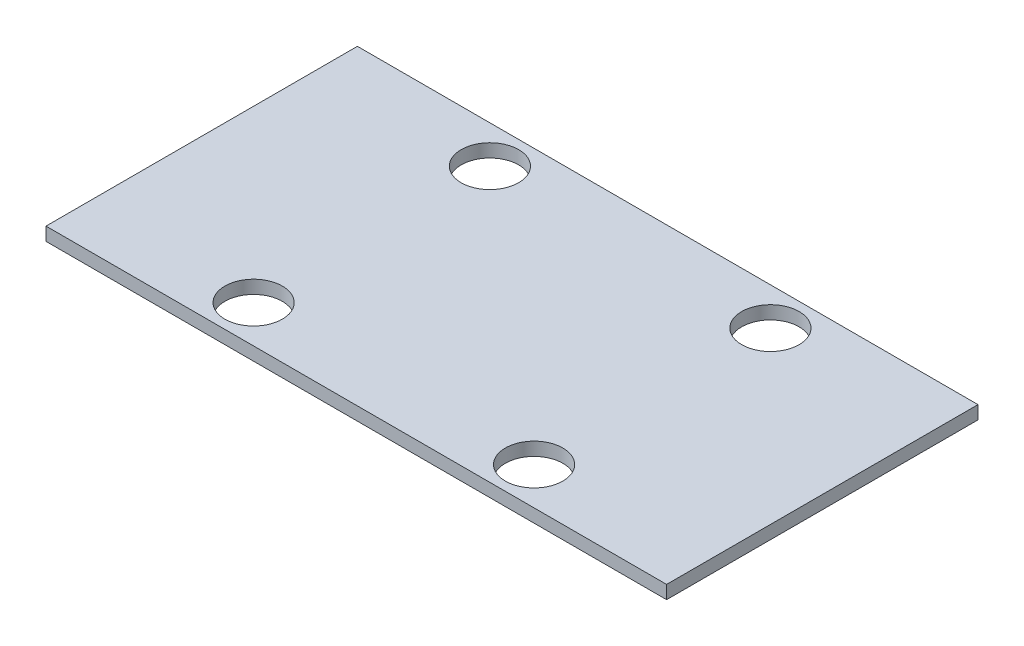
ISO-10303-21;
HEADER;
FILE_DESCRIPTION(('STEP AP214'),'2;1');
FILE_NAME('part.step','',(''),(''),'','','');
FILE_SCHEMA(('AUTOMOTIVE_DESIGN { 1 0 10303 214 1 1 1 1 }'));
ENDSEC;
DATA;
#1=APPLICATION_CONTEXT('core data for automotive mechanical design processes');
#2=APPLICATION_PROTOCOL_DEFINITION('international standard','automotive_design',2000,#1);
#3=PRODUCT_CONTEXT('',#1,'mechanical');
#4=PRODUCT('Part','Part','',(#3));
#5=PRODUCT_RELATED_PRODUCT_CATEGORY('part','',(#4));
#6=PRODUCT_DEFINITION_FORMATION('','',#4);
#7=PRODUCT_DEFINITION_CONTEXT('part definition',#1,'design');
#8=PRODUCT_DEFINITION('design','',#6,#7);
#9=PRODUCT_DEFINITION_SHAPE('','',#8);
#10=(LENGTH_UNIT() NAMED_UNIT(*) SI_UNIT(.MILLI.,.METRE.));
#11=(NAMED_UNIT(*) PLANE_ANGLE_UNIT() SI_UNIT($,.RADIAN.));
#12=(NAMED_UNIT(*) SI_UNIT($,.STERADIAN.) SOLID_ANGLE_UNIT());
#13=UNCERTAINTY_MEASURE_WITH_UNIT(LENGTH_MEASURE(1.E-05),#10,'distance_accuracy_value','');
#14=(GEOMETRIC_REPRESENTATION_CONTEXT(3) GLOBAL_UNCERTAINTY_ASSIGNED_CONTEXT((#13)) GLOBAL_UNIT_ASSIGNED_CONTEXT((#10,
#11,#12)) REPRESENTATION_CONTEXT('',''));
#15=CARTESIAN_POINT('',(0.,0.,0.));
#16=DIRECTION('',(0.,0.,1.));
#17=DIRECTION('',(1.,0.,0.));
#18=AXIS2_PLACEMENT_3D('',#15,#16,#17);
#19=CARTESIAN_POINT('',(0.,1.524,0.));
#20=DIRECTION('',(1.,0.,0.));
#21=DIRECTION('',(0.,0.,-1.));
#22=AXIS2_PLACEMENT_3D('',#19,#20,#21);
#23=PLANE('',#22);
#24=DIRECTION('',(0.,0.,1.));
#25=VECTOR('',#24,1.);
#26=CARTESIAN_POINT('',(0.,0.,0.));
#27=LINE('',#26,#25);
#28=CARTESIAN_POINT('',(0.,0.,-35.814));
#29=VERTEX_POINT('',#28);
#30=CARTESIAN_POINT('',(0.,0.,0.));
#31=VERTEX_POINT('',#30);
#32=EDGE_CURVE('E95',#29,#31,#27,.T.);
#33=ORIENTED_EDGE('',*,*,#32,.T.);
#34=DIRECTION('',(0.,-1.,0.));
#35=VECTOR('',#34,1.);
#36=CARTESIAN_POINT('',(0.,1.524,0.));
#37=LINE('',#36,#35);
#38=CARTESIAN_POINT('',(0.,1.524,0.));
#39=VERTEX_POINT('',#38);
#40=EDGE_CURVE('E11',#39,#31,#37,.T.);
#41=ORIENTED_EDGE('',*,*,#40,.F.);
#42=DIRECTION('',(0.,0.,1.));
#43=VECTOR('',#42,1.);
#44=CARTESIAN_POINT('',(0.,1.524,0.));
#45=LINE('',#44,#43);
#46=CARTESIAN_POINT('',(0.,1.524,-35.814));
#47=VERTEX_POINT('',#46);
#48=EDGE_CURVE('E83',#47,#39,#45,.T.);
#49=ORIENTED_EDGE('',*,*,#48,.F.);
#50=DIRECTION('',(0.,-1.,0.));
#51=VECTOR('',#50,1.);
#52=CARTESIAN_POINT('',(0.,1.524,-35.814));
#53=LINE('',#52,#51);
#54=EDGE_CURVE('E91',#47,#29,#53,.T.);
#55=ORIENTED_EDGE('',*,*,#54,.T.);
#56=EDGE_LOOP('',(#33,#41,#49,#55));
#57=FACE_BOUND('',#56,.T.);
#58=ADVANCED_FACE('F32',(#57),#23,.F.);
#59=CARTESIAN_POINT('',(0.,1.524,0.));
#60=DIRECTION('',(0.,0.,-1.));
#61=DIRECTION('',(-1.,0.,0.));
#62=AXIS2_PLACEMENT_3D('',#59,#60,#61);
#63=PLANE('',#62);
#64=DIRECTION('',(1.,0.,0.));
#65=VECTOR('',#64,1.);
#66=CARTESIAN_POINT('',(0.,0.,0.));
#67=LINE('',#66,#65);
#68=CARTESIAN_POINT('',(71.374,0.,0.));
#69=VERTEX_POINT('',#68);
#70=EDGE_CURVE('E87',#31,#69,#67,.T.);
#71=ORIENTED_EDGE('',*,*,#70,.T.);
#72=DIRECTION('',(0.,-1.,0.));
#73=VECTOR('',#72,1.);
#74=CARTESIAN_POINT('',(71.374,1.524,0.));
#75=LINE('',#74,#73);
#76=CARTESIAN_POINT('',(71.374,1.524,0.));
#77=VERTEX_POINT('',#76);
#78=EDGE_CURVE('E40',#77,#69,#75,.T.);
#79=ORIENTED_EDGE('',*,*,#78,.F.);
#80=DIRECTION('',(1.,0.,0.));
#81=VECTOR('',#80,1.);
#82=CARTESIAN_POINT('',(0.,1.524,0.));
#83=LINE('',#82,#81);
#84=EDGE_CURVE('E78',#39,#77,#83,.T.);
#85=ORIENTED_EDGE('',*,*,#84,.F.);
#86=ORIENTED_EDGE('',*,*,#40,.T.);
#87=EDGE_LOOP('',(#71,#79,#85,#86));
#88=FACE_BOUND('',#87,.T.);
#89=ADVANCED_FACE('F86',(#88),#63,.F.);
#90=CARTESIAN_POINT('',(71.374,1.524,0.));
#91=DIRECTION('',(-1.,0.,0.));
#92=DIRECTION('',(0.,0.,1.));
#93=AXIS2_PLACEMENT_3D('',#90,#91,#92);
#94=PLANE('',#93);
#95=DIRECTION('',(0.,0.,-1.));
#96=VECTOR('',#95,1.);
#97=CARTESIAN_POINT('',(71.374,0.,0.));
#98=LINE('',#97,#96);
#99=CARTESIAN_POINT('',(71.374,0.,-35.814));
#100=VERTEX_POINT('',#99);
#101=EDGE_CURVE('E65',#69,#100,#98,.T.);
#102=ORIENTED_EDGE('',*,*,#101,.T.);
#103=DIRECTION('',(0.,-1.,0.));
#104=VECTOR('',#103,1.);
#105=CARTESIAN_POINT('',(71.374,1.524,-35.814));
#106=LINE('',#105,#104);
#107=CARTESIAN_POINT('',(71.374,1.524,-35.814));
#108=VERTEX_POINT('',#107);
#109=EDGE_CURVE('E88',#108,#100,#106,.T.);
#110=ORIENTED_EDGE('',*,*,#109,.F.);
#111=DIRECTION('',(0.,0.,-1.));
#112=VECTOR('',#111,1.);
#113=CARTESIAN_POINT('',(71.374,1.524,0.));
#114=LINE('',#113,#112);
#115=EDGE_CURVE('E81',#77,#108,#114,.T.);
#116=ORIENTED_EDGE('',*,*,#115,.F.);
#117=ORIENTED_EDGE('',*,*,#78,.T.);
#118=EDGE_LOOP('',(#102,#110,#116,#117));
#119=FACE_BOUND('',#118,.T.);
#120=ADVANCED_FACE('F89',(#119),#94,.F.);
#121=CARTESIAN_POINT('',(0.,1.524,-35.814));
#122=DIRECTION('',(0.,0.,1.));
#123=DIRECTION('',(1.,0.,0.));
#124=AXIS2_PLACEMENT_3D('',#121,#122,#123);
#125=PLANE('',#124);
#126=DIRECTION('',(-1.,0.,0.));
#127=VECTOR('',#126,1.);
#128=CARTESIAN_POINT('',(0.,0.,-35.814));
#129=LINE('',#128,#127);
#130=EDGE_CURVE('E71',#100,#29,#129,.T.);
#131=ORIENTED_EDGE('',*,*,#130,.T.);
#132=ORIENTED_EDGE('',*,*,#54,.F.);
#133=DIRECTION('',(-1.,0.,0.));
#134=VECTOR('',#133,1.);
#135=CARTESIAN_POINT('',(0.,1.524,-35.814));
#136=LINE('',#135,#134);
#137=EDGE_CURVE('E48',#108,#47,#136,.T.);
#138=ORIENTED_EDGE('',*,*,#137,.F.);
#139=ORIENTED_EDGE('',*,*,#109,.T.);
#140=EDGE_LOOP('',(#131,#132,#138,#139));
#141=FACE_BOUND('',#140,.T.);
#142=ADVANCED_FACE('F103',(#141),#125,.F.);
#143=CARTESIAN_POINT('',(0.,1.524,0.));
#144=DIRECTION('',(0.,-1.,0.));
#145=DIRECTION('',(0.,0.,-1.));
#146=AXIS2_PLACEMENT_3D('',#143,#144,#145);
#147=PLANE('',#146);
#148=CARTESIAN_POINT('',(51.816,1.524,-4.318));
#149=DIRECTION('',(0.,1.,0.));
#150=DIRECTION('',(0.,0.,1.));
#151=AXIS2_PLACEMENT_3D('',#148,#149,#150);
#152=CIRCLE('',#151,3.302);
#153=CARTESIAN_POINT('',(51.816,1.524,-1.016));
#154=VERTEX_POINT('',#153);
#155=EDGE_CURVE('E127',#154,#154,#152,.T.);
#156=ORIENTED_EDGE('',*,*,#155,.F.);
#157=EDGE_LOOP('',(#156));
#158=FACE_BOUND('',#157,.T.);
#159=CARTESIAN_POINT('',(19.558,1.524,-31.496));
#160=DIRECTION('',(0.,1.,0.));
#161=DIRECTION('',(0.,0.,1.));
#162=AXIS2_PLACEMENT_3D('',#159,#160,#161);
#163=CIRCLE('',#162,3.302);
#164=CARTESIAN_POINT('',(19.558,1.524,-28.194));
#165=VERTEX_POINT('',#164);
#166=EDGE_CURVE('E121',#165,#165,#163,.T.);
#167=ORIENTED_EDGE('',*,*,#166,.F.);
#168=EDGE_LOOP('',(#167));
#169=FACE_BOUND('',#168,.T.);
#170=CARTESIAN_POINT('',(51.816,1.524,-31.496));
#171=DIRECTION('',(0.,1.,0.));
#172=DIRECTION('',(0.,0.,1.));
#173=AXIS2_PLACEMENT_3D('',#170,#171,#172);
#174=CIRCLE('',#173,3.302);
#175=CARTESIAN_POINT('',(51.816,1.524,-28.194));
#176=VERTEX_POINT('',#175);
#177=EDGE_CURVE('E115',#176,#176,#174,.T.);
#178=ORIENTED_EDGE('',*,*,#177,.F.);
#179=EDGE_LOOP('',(#178));
#180=FACE_BOUND('',#179,.T.);
#181=CARTESIAN_POINT('',(19.558,1.524,-4.318));
#182=DIRECTION('',(0.,1.,0.));
#183=DIRECTION('',(0.,0.,1.));
#184=AXIS2_PLACEMENT_3D('',#181,#182,#183);
#185=CIRCLE('',#184,3.302);
#186=CARTESIAN_POINT('',(19.558,1.524,-1.016));
#187=VERTEX_POINT('',#186);
#188=EDGE_CURVE('E109',#187,#187,#185,.T.);
#189=ORIENTED_EDGE('',*,*,#188,.F.);
#190=EDGE_LOOP('',(#189));
#191=FACE_BOUND('',#190,.T.);
#192=ORIENTED_EDGE('',*,*,#48,.T.);
#193=ORIENTED_EDGE('',*,*,#84,.T.);
#194=ORIENTED_EDGE('',*,*,#115,.T.);
#195=ORIENTED_EDGE('',*,*,#137,.T.);
#196=EDGE_LOOP('',(#192,#193,#194,#195));
#197=FACE_BOUND('',#196,.T.);
#198=ADVANCED_FACE('F79',(#158,#169,#180,#191,#197),#147,.F.);
#199=CARTESIAN_POINT('',(0.,0.,0.));
#200=DIRECTION('',(0.,-1.,0.));
#201=DIRECTION('',(0.,0.,-1.));
#202=AXIS2_PLACEMENT_3D('',#199,#200,#201);
#203=PLANE('',#202);
#204=CARTESIAN_POINT('',(51.816,0.,-4.318));
#205=DIRECTION('',(0.,1.,0.));
#206=DIRECTION('',(0.,0.,1.));
#207=AXIS2_PLACEMENT_3D('',#204,#205,#206);
#208=CIRCLE('',#207,3.302);
#209=CARTESIAN_POINT('',(51.816,0.,-1.016));
#210=VERTEX_POINT('',#209);
#211=EDGE_CURVE('E124',#210,#210,#208,.T.);
#212=ORIENTED_EDGE('',*,*,#211,.T.);
#213=EDGE_LOOP('',(#212));
#214=FACE_BOUND('',#213,.T.);
#215=CARTESIAN_POINT('',(19.558,0.,-31.496));
#216=DIRECTION('',(0.,1.,0.));
#217=DIRECTION('',(0.,0.,1.));
#218=AXIS2_PLACEMENT_3D('',#215,#216,#217);
#219=CIRCLE('',#218,3.302);
#220=CARTESIAN_POINT('',(19.558,0.,-28.194));
#221=VERTEX_POINT('',#220);
#222=EDGE_CURVE('E118',#221,#221,#219,.T.);
#223=ORIENTED_EDGE('',*,*,#222,.T.);
#224=EDGE_LOOP('',(#223));
#225=FACE_BOUND('',#224,.T.);
#226=CARTESIAN_POINT('',(51.816,0.,-31.496));
#227=DIRECTION('',(0.,1.,0.));
#228=DIRECTION('',(0.,0.,1.));
#229=AXIS2_PLACEMENT_3D('',#226,#227,#228);
#230=CIRCLE('',#229,3.302);
#231=CARTESIAN_POINT('',(51.816,0.,-28.194));
#232=VERTEX_POINT('',#231);
#233=EDGE_CURVE('E112',#232,#232,#230,.T.);
#234=ORIENTED_EDGE('',*,*,#233,.T.);
#235=EDGE_LOOP('',(#234));
#236=FACE_BOUND('',#235,.T.);
#237=CARTESIAN_POINT('',(19.558,0.,-4.318));
#238=DIRECTION('',(0.,1.,0.));
#239=DIRECTION('',(0.,0.,1.));
#240=AXIS2_PLACEMENT_3D('',#237,#238,#239);
#241=CIRCLE('',#240,3.302);
#242=CARTESIAN_POINT('',(19.558,0.,-1.016));
#243=VERTEX_POINT('',#242);
#244=EDGE_CURVE('E98',#243,#243,#241,.T.);
#245=ORIENTED_EDGE('',*,*,#244,.T.);
#246=EDGE_LOOP('',(#245));
#247=FACE_BOUND('',#246,.T.);
#248=ORIENTED_EDGE('',*,*,#32,.F.);
#249=ORIENTED_EDGE('',*,*,#130,.F.);
#250=ORIENTED_EDGE('',*,*,#101,.F.);
#251=ORIENTED_EDGE('',*,*,#70,.F.);
#252=EDGE_LOOP('',(#248,#249,#250,#251));
#253=FACE_BOUND('',#252,.T.);
#254=ADVANCED_FACE('F106',(#214,#225,#236,#247,#253),#203,.T.);
#255=CARTESIAN_POINT('',(19.558,0.,-4.318));
#256=DIRECTION('',(0.,1.,0.));
#257=DIRECTION('',(0.,0.,1.));
#258=AXIS2_PLACEMENT_3D('',#255,#256,#257);
#259=CYLINDRICAL_SURFACE('',#258,3.302);
#260=CARTESIAN_POINT('',(19.558,0.,-1.016));
#261=CARTESIAN_POINT('',(19.558,0.015875,-1.016));
#262=CARTESIAN_POINT('',(19.558,0.03175,-1.016));
#263=CARTESIAN_POINT('',(19.558,0.0635,-1.016));
#264=CARTESIAN_POINT('',(19.558,0.079375,-1.016));
#265=CARTESIAN_POINT('',(19.558,0.111125,-1.016));
#266=CARTESIAN_POINT('',(19.558,0.127,-1.016));
#267=CARTESIAN_POINT('',(19.558,0.15875,-1.016));
#268=CARTESIAN_POINT('',(19.558,0.174625,-1.016));
#269=CARTESIAN_POINT('',(19.558,0.206375,-1.016));
#270=CARTESIAN_POINT('',(19.558,0.22225,-1.016));
#271=CARTESIAN_POINT('',(19.558,0.254,-1.016));
#272=CARTESIAN_POINT('',(19.558,0.269875,-1.016));
#273=CARTESIAN_POINT('',(19.558,0.301625,-1.016));
#274=CARTESIAN_POINT('',(19.558,0.3175,-1.016));
#275=CARTESIAN_POINT('',(19.558,0.34925,-1.016));
#276=CARTESIAN_POINT('',(19.558,0.365125,-1.016));
#277=CARTESIAN_POINT('',(19.558,0.396875,-1.016));
#278=CARTESIAN_POINT('',(19.558,0.41275,-1.016));
#279=CARTESIAN_POINT('',(19.558,0.4445,-1.016));
#280=CARTESIAN_POINT('',(19.558,0.460375,-1.016));
#281=CARTESIAN_POINT('',(19.558,0.492125,-1.016));
#282=CARTESIAN_POINT('',(19.558,0.508,-1.016));
#283=CARTESIAN_POINT('',(19.558,0.53975,-1.016));
#284=CARTESIAN_POINT('',(19.558,0.555625,-1.016));
#285=CARTESIAN_POINT('',(19.558,0.587375,-1.016));
#286=CARTESIAN_POINT('',(19.558,0.60325,-1.016));
#287=CARTESIAN_POINT('',(19.558,0.635,-1.016));
#288=CARTESIAN_POINT('',(19.558,0.650875,-1.016));
#289=CARTESIAN_POINT('',(19.558,0.682625,-1.016));
#290=CARTESIAN_POINT('',(19.558,0.6985,-1.016));
#291=CARTESIAN_POINT('',(19.558,0.73025,-1.016));
#292=CARTESIAN_POINT('',(19.558,0.746125,-1.016));
#293=CARTESIAN_POINT('',(19.558,0.777875,-1.016));
#294=CARTESIAN_POINT('',(19.558,0.79375,-1.016));
#295=CARTESIAN_POINT('',(19.558,0.8255,-1.016));
#296=CARTESIAN_POINT('',(19.558,0.841375,-1.016));
#297=CARTESIAN_POINT('',(19.558,0.873125,-1.016));
#298=CARTESIAN_POINT('',(19.558,0.889,-1.016));
#299=CARTESIAN_POINT('',(19.558,0.92075,-1.016));
#300=CARTESIAN_POINT('',(19.558,0.936625,-1.016));
#301=CARTESIAN_POINT('',(19.558,0.968375,-1.016));
#302=CARTESIAN_POINT('',(19.558,0.98425,-1.016));
#303=CARTESIAN_POINT('',(19.558,1.016,-1.016));
#304=CARTESIAN_POINT('',(19.558,1.031875,-1.016));
#305=CARTESIAN_POINT('',(19.558,1.063625,-1.016));
#306=CARTESIAN_POINT('',(19.558,1.0795,-1.016));
#307=CARTESIAN_POINT('',(19.558,1.11125,-1.016));
#308=CARTESIAN_POINT('',(19.558,1.127125,-1.016));
#309=CARTESIAN_POINT('',(19.558,1.158875,-1.016));
#310=CARTESIAN_POINT('',(19.558,1.17475,-1.016));
#311=CARTESIAN_POINT('',(19.558,1.2065,-1.016));
#312=CARTESIAN_POINT('',(19.558,1.222375,-1.016));
#313=CARTESIAN_POINT('',(19.558,1.254125,-1.016));
#314=CARTESIAN_POINT('',(19.558,1.27,-1.016));
#315=CARTESIAN_POINT('',(19.558,1.30175,-1.016));
#316=CARTESIAN_POINT('',(19.558,1.317625,-1.016));
#317=CARTESIAN_POINT('',(19.558,1.349375,-1.016));
#318=CARTESIAN_POINT('',(19.558,1.36525,-1.016));
#319=CARTESIAN_POINT('',(19.558,1.397,-1.016));
#320=CARTESIAN_POINT('',(19.558,1.412875,-1.016));
#321=CARTESIAN_POINT('',(19.558,1.444625,-1.016));
#322=CARTESIAN_POINT('',(19.558,1.4605,-1.016));
#323=CARTESIAN_POINT('',(19.558,1.49225,-1.016));
#324=CARTESIAN_POINT('',(19.558,1.508125,-1.016));
#325=CARTESIAN_POINT('',(19.558,1.524,-1.016));
#326=B_SPLINE_CURVE_WITH_KNOTS('',3,(#260,#261,#262,#263,#264,#265,#266,#267,#268,#269,#270,
#271,#272,#273,#274,#275,#276,#277,#278,#279,#280,#281,#282,#283,#284,#285,#286,#287,#288,#289,
#290,#291,#292,#293,#294,#295,#296,#297,#298,#299,#300,#301,#302,#303,#304,#305,#306,#307,#308,
#309,#310,#311,#312,#313,#314,#315,#316,#317,#318,#319,#320,#321,#322,#323,#324,#325),
.UNSPECIFIED.,.F.,.F.,(4,2,2,2,2,2,2,2,2,2,2,2,2,2,2,2,2,2,2,2,2,2,2,2,2,2,2,2,2,2,2,2,4),(0.,
0.047625,0.09525,0.142875,0.1905,0.238125,0.28575,0.333375,0.381,0.428625,0.47625,0.523875,
0.5715,0.619125,0.66675,0.714375,0.762,0.809625,0.85725,0.904875,0.9525,1.000125,1.04775,
1.095375,1.143,1.190625,1.23825,1.285875,1.3335,1.381125,1.42875,1.476375,1.524),.UNSPECIFIED.);
#327=EDGE_CURVE('BSEAM151',#243,#187,#326,.T.);
#328=ORIENTED_EDGE('',*,*,#244,.F.);
#329=ORIENTED_EDGE('',*,*,#188,.T.);
#330=ORIENTED_EDGE('',*,*,#327,.T.);
#331=ORIENTED_EDGE('',*,*,#327,.F.);
#332=EDGE_LOOP('',(#328,#330,#329,#331));
#333=FACE_BOUND('',#332,.T.);
#334=ADVANCED_FACE('F151',(#333),#259,.F.);
#335=CARTESIAN_POINT('',(51.816,0.,-31.496));
#336=DIRECTION('',(0.,1.,0.));
#337=DIRECTION('',(0.,0.,1.));
#338=AXIS2_PLACEMENT_3D('',#335,#336,#337);
#339=CYLINDRICAL_SURFACE('',#338,3.302);
#340=CARTESIAN_POINT('',(51.816,0.,-28.194));
#341=CARTESIAN_POINT('',(51.816,0.015875,-28.194));
#342=CARTESIAN_POINT('',(51.816,0.03175,-28.194));
#343=CARTESIAN_POINT('',(51.816,0.0635,-28.194));
#344=CARTESIAN_POINT('',(51.816,0.079375,-28.194));
#345=CARTESIAN_POINT('',(51.816,0.111125,-28.194));
#346=CARTESIAN_POINT('',(51.816,0.127,-28.194));
#347=CARTESIAN_POINT('',(51.816,0.15875,-28.194));
#348=CARTESIAN_POINT('',(51.816,0.174625,-28.194));
#349=CARTESIAN_POINT('',(51.816,0.206375,-28.194));
#350=CARTESIAN_POINT('',(51.816,0.22225,-28.194));
#351=CARTESIAN_POINT('',(51.816,0.254,-28.194));
#352=CARTESIAN_POINT('',(51.816,0.269875,-28.194));
#353=CARTESIAN_POINT('',(51.816,0.301625,-28.194));
#354=CARTESIAN_POINT('',(51.816,0.3175,-28.194));
#355=CARTESIAN_POINT('',(51.816,0.34925,-28.194));
#356=CARTESIAN_POINT('',(51.816,0.365125,-28.194));
#357=CARTESIAN_POINT('',(51.816,0.396875,-28.194));
#358=CARTESIAN_POINT('',(51.816,0.41275,-28.194));
#359=CARTESIAN_POINT('',(51.816,0.4445,-28.194));
#360=CARTESIAN_POINT('',(51.816,0.460375,-28.194));
#361=CARTESIAN_POINT('',(51.816,0.492125,-28.194));
#362=CARTESIAN_POINT('',(51.816,0.508,-28.194));
#363=CARTESIAN_POINT('',(51.816,0.53975,-28.194));
#364=CARTESIAN_POINT('',(51.816,0.555625,-28.194));
#365=CARTESIAN_POINT('',(51.816,0.587375,-28.194));
#366=CARTESIAN_POINT('',(51.816,0.60325,-28.194));
#367=CARTESIAN_POINT('',(51.816,0.635,-28.194));
#368=CARTESIAN_POINT('',(51.816,0.650875,-28.194));
#369=CARTESIAN_POINT('',(51.816,0.682625,-28.194));
#370=CARTESIAN_POINT('',(51.816,0.6985,-28.194));
#371=CARTESIAN_POINT('',(51.816,0.73025,-28.194));
#372=CARTESIAN_POINT('',(51.816,0.746125,-28.194));
#373=CARTESIAN_POINT('',(51.816,0.777875,-28.194));
#374=CARTESIAN_POINT('',(51.816,0.79375,-28.194));
#375=CARTESIAN_POINT('',(51.816,0.8255,-28.194));
#376=CARTESIAN_POINT('',(51.816,0.841375,-28.194));
#377=CARTESIAN_POINT('',(51.816,0.873125,-28.194));
#378=CARTESIAN_POINT('',(51.816,0.889,-28.194));
#379=CARTESIAN_POINT('',(51.816,0.92075,-28.194));
#380=CARTESIAN_POINT('',(51.816,0.936625,-28.194));
#381=CARTESIAN_POINT('',(51.816,0.968375,-28.194));
#382=CARTESIAN_POINT('',(51.816,0.98425,-28.194));
#383=CARTESIAN_POINT('',(51.816,1.016,-28.194));
#384=CARTESIAN_POINT('',(51.816,1.031875,-28.194));
#385=CARTESIAN_POINT('',(51.816,1.063625,-28.194));
#386=CARTESIAN_POINT('',(51.816,1.0795,-28.194));
#387=CARTESIAN_POINT('',(51.816,1.11125,-28.194));
#388=CARTESIAN_POINT('',(51.816,1.127125,-28.194));
#389=CARTESIAN_POINT('',(51.816,1.158875,-28.194));
#390=CARTESIAN_POINT('',(51.816,1.17475,-28.194));
#391=CARTESIAN_POINT('',(51.816,1.2065,-28.194));
#392=CARTESIAN_POINT('',(51.816,1.222375,-28.194));
#393=CARTESIAN_POINT('',(51.816,1.254125,-28.194));
#394=CARTESIAN_POINT('',(51.816,1.27,-28.194));
#395=CARTESIAN_POINT('',(51.816,1.30175,-28.194));
#396=CARTESIAN_POINT('',(51.816,1.317625,-28.194));
#397=CARTESIAN_POINT('',(51.816,1.349375,-28.194));
#398=CARTESIAN_POINT('',(51.816,1.36525,-28.194));
#399=CARTESIAN_POINT('',(51.816,1.397,-28.194));
#400=CARTESIAN_POINT('',(51.816,1.412875,-28.194));
#401=CARTESIAN_POINT('',(51.816,1.444625,-28.194));
#402=CARTESIAN_POINT('',(51.816,1.4605,-28.194));
#403=CARTESIAN_POINT('',(51.816,1.49225,-28.194));
#404=CARTESIAN_POINT('',(51.816,1.508125,-28.194));
#405=CARTESIAN_POINT('',(51.816,1.524,-28.194));
#406=B_SPLINE_CURVE_WITH_KNOTS('',3,(#340,#341,#342,#343,#344,#345,#346,#347,#348,#349,#350,
#351,#352,#353,#354,#355,#356,#357,#358,#359,#360,#361,#362,#363,#364,#365,#366,#367,#368,#369,
#370,#371,#372,#373,#374,#375,#376,#377,#378,#379,#380,#381,#382,#383,#384,#385,#386,#387,#388,
#389,#390,#391,#392,#393,#394,#395,#396,#397,#398,#399,#400,#401,#402,#403,#404,#405),
.UNSPECIFIED.,.F.,.F.,(4,2,2,2,2,2,2,2,2,2,2,2,2,2,2,2,2,2,2,2,2,2,2,2,2,2,2,2,2,2,2,2,4),(0.,
0.047625,0.09525,0.142875,0.1905,0.238125,0.28575,0.333375,0.381,0.428625,0.47625,0.523875,
0.5715,0.619125,0.66675,0.714375,0.762,0.809625,0.85725,0.904875,0.9525,1.000125,1.04775,
1.095375,1.143,1.190625,1.23825,1.285875,1.3335,1.381125,1.42875,1.476375,1.524),.UNSPECIFIED.);
#407=EDGE_CURVE('BSEAM153',#232,#176,#406,.T.);
#408=ORIENTED_EDGE('',*,*,#233,.F.);
#409=ORIENTED_EDGE('',*,*,#177,.T.);
#410=ORIENTED_EDGE('',*,*,#407,.T.);
#411=ORIENTED_EDGE('',*,*,#407,.F.);
#412=EDGE_LOOP('',(#408,#410,#409,#411));
#413=FACE_BOUND('',#412,.T.);
#414=ADVANCED_FACE('F153',(#413),#339,.F.);
#415=CARTESIAN_POINT('',(19.558,0.,-31.496));
#416=DIRECTION('',(0.,1.,0.));
#417=DIRECTION('',(0.,0.,1.));
#418=AXIS2_PLACEMENT_3D('',#415,#416,#417);
#419=CYLINDRICAL_SURFACE('',#418,3.302);
#420=CARTESIAN_POINT('',(19.558,0.,-28.194));
#421=CARTESIAN_POINT('',(19.558,0.015875,-28.194));
#422=CARTESIAN_POINT('',(19.558,0.03175,-28.194));
#423=CARTESIAN_POINT('',(19.558,0.0635,-28.194));
#424=CARTESIAN_POINT('',(19.558,0.079375,-28.194));
#425=CARTESIAN_POINT('',(19.558,0.111125,-28.194));
#426=CARTESIAN_POINT('',(19.558,0.127,-28.194));
#427=CARTESIAN_POINT('',(19.558,0.15875,-28.194));
#428=CARTESIAN_POINT('',(19.558,0.174625,-28.194));
#429=CARTESIAN_POINT('',(19.558,0.206375,-28.194));
#430=CARTESIAN_POINT('',(19.558,0.22225,-28.194));
#431=CARTESIAN_POINT('',(19.558,0.254,-28.194));
#432=CARTESIAN_POINT('',(19.558,0.269875,-28.194));
#433=CARTESIAN_POINT('',(19.558,0.301625,-28.194));
#434=CARTESIAN_POINT('',(19.558,0.3175,-28.194));
#435=CARTESIAN_POINT('',(19.558,0.34925,-28.194));
#436=CARTESIAN_POINT('',(19.558,0.365125,-28.194));
#437=CARTESIAN_POINT('',(19.558,0.396875,-28.194));
#438=CARTESIAN_POINT('',(19.558,0.41275,-28.194));
#439=CARTESIAN_POINT('',(19.558,0.4445,-28.194));
#440=CARTESIAN_POINT('',(19.558,0.460375,-28.194));
#441=CARTESIAN_POINT('',(19.558,0.492125,-28.194));
#442=CARTESIAN_POINT('',(19.558,0.508,-28.194));
#443=CARTESIAN_POINT('',(19.558,0.53975,-28.194));
#444=CARTESIAN_POINT('',(19.558,0.555625,-28.194));
#445=CARTESIAN_POINT('',(19.558,0.587375,-28.194));
#446=CARTESIAN_POINT('',(19.558,0.60325,-28.194));
#447=CARTESIAN_POINT('',(19.558,0.635,-28.194));
#448=CARTESIAN_POINT('',(19.558,0.650875,-28.194));
#449=CARTESIAN_POINT('',(19.558,0.682625,-28.194));
#450=CARTESIAN_POINT('',(19.558,0.6985,-28.194));
#451=CARTESIAN_POINT('',(19.558,0.73025,-28.194));
#452=CARTESIAN_POINT('',(19.558,0.746125,-28.194));
#453=CARTESIAN_POINT('',(19.558,0.777875,-28.194));
#454=CARTESIAN_POINT('',(19.558,0.79375,-28.194));
#455=CARTESIAN_POINT('',(19.558,0.8255,-28.194));
#456=CARTESIAN_POINT('',(19.558,0.841375,-28.194));
#457=CARTESIAN_POINT('',(19.558,0.873125,-28.194));
#458=CARTESIAN_POINT('',(19.558,0.889,-28.194));
#459=CARTESIAN_POINT('',(19.558,0.92075,-28.194));
#460=CARTESIAN_POINT('',(19.558,0.936625,-28.194));
#461=CARTESIAN_POINT('',(19.558,0.968375,-28.194));
#462=CARTESIAN_POINT('',(19.558,0.98425,-28.194));
#463=CARTESIAN_POINT('',(19.558,1.016,-28.194));
#464=CARTESIAN_POINT('',(19.558,1.031875,-28.194));
#465=CARTESIAN_POINT('',(19.558,1.063625,-28.194));
#466=CARTESIAN_POINT('',(19.558,1.0795,-28.194));
#467=CARTESIAN_POINT('',(19.558,1.11125,-28.194));
#468=CARTESIAN_POINT('',(19.558,1.127125,-28.194));
#469=CARTESIAN_POINT('',(19.558,1.158875,-28.194));
#470=CARTESIAN_POINT('',(19.558,1.17475,-28.194));
#471=CARTESIAN_POINT('',(19.558,1.2065,-28.194));
#472=CARTESIAN_POINT('',(19.558,1.222375,-28.194));
#473=CARTESIAN_POINT('',(19.558,1.254125,-28.194));
#474=CARTESIAN_POINT('',(19.558,1.27,-28.194));
#475=CARTESIAN_POINT('',(19.558,1.30175,-28.194));
#476=CARTESIAN_POINT('',(19.558,1.317625,-28.194));
#477=CARTESIAN_POINT('',(19.558,1.349375,-28.194));
#478=CARTESIAN_POINT('',(19.558,1.36525,-28.194));
#479=CARTESIAN_POINT('',(19.558,1.397,-28.194));
#480=CARTESIAN_POINT('',(19.558,1.412875,-28.194));
#481=CARTESIAN_POINT('',(19.558,1.444625,-28.194));
#482=CARTESIAN_POINT('',(19.558,1.4605,-28.194));
#483=CARTESIAN_POINT('',(19.558,1.49225,-28.194));
#484=CARTESIAN_POINT('',(19.558,1.508125,-28.194));
#485=CARTESIAN_POINT('',(19.558,1.524,-28.194));
#486=B_SPLINE_CURVE_WITH_KNOTS('',3,(#420,#421,#422,#423,#424,#425,#426,#427,#428,#429,#430,
#431,#432,#433,#434,#435,#436,#437,#438,#439,#440,#441,#442,#443,#444,#445,#446,#447,#448,#449,
#450,#451,#452,#453,#454,#455,#456,#457,#458,#459,#460,#461,#462,#463,#464,#465,#466,#467,#468,
#469,#470,#471,#472,#473,#474,#475,#476,#477,#478,#479,#480,#481,#482,#483,#484,#485),
.UNSPECIFIED.,.F.,.F.,(4,2,2,2,2,2,2,2,2,2,2,2,2,2,2,2,2,2,2,2,2,2,2,2,2,2,2,2,2,2,2,2,4),(0.,
0.047625,0.09525,0.142875,0.1905,0.238125,0.28575,0.333375,0.381,0.428625,0.47625,0.523875,
0.5715,0.619125,0.66675,0.714375,0.762,0.809625,0.85725,0.904875,0.9525,1.000125,1.04775,
1.095375,1.143,1.190625,1.23825,1.285875,1.3335,1.381125,1.42875,1.476375,1.524),.UNSPECIFIED.);
#487=EDGE_CURVE('BSEAM138',#221,#165,#486,.T.);
#488=ORIENTED_EDGE('',*,*,#222,.F.);
#489=ORIENTED_EDGE('',*,*,#166,.T.);
#490=ORIENTED_EDGE('',*,*,#487,.T.);
#491=ORIENTED_EDGE('',*,*,#487,.F.);
#492=EDGE_LOOP('',(#488,#490,#489,#491));
#493=FACE_BOUND('',#492,.T.);
#494=ADVANCED_FACE('F138',(#493),#419,.F.);
#495=CARTESIAN_POINT('',(51.816,0.,-4.318));
#496=DIRECTION('',(0.,1.,0.));
#497=DIRECTION('',(0.,0.,1.));
#498=AXIS2_PLACEMENT_3D('',#495,#496,#497);
#499=CYLINDRICAL_SURFACE('',#498,3.302);
#500=CARTESIAN_POINT('',(51.816,0.,-1.016));
#501=CARTESIAN_POINT('',(51.816,0.015875,-1.016));
#502=CARTESIAN_POINT('',(51.816,0.03175,-1.016));
#503=CARTESIAN_POINT('',(51.816,0.0635,-1.016));
#504=CARTESIAN_POINT('',(51.816,0.079375,-1.016));
#505=CARTESIAN_POINT('',(51.816,0.111125,-1.016));
#506=CARTESIAN_POINT('',(51.816,0.127,-1.016));
#507=CARTESIAN_POINT('',(51.816,0.15875,-1.016));
#508=CARTESIAN_POINT('',(51.816,0.174625,-1.016));
#509=CARTESIAN_POINT('',(51.816,0.206375,-1.016));
#510=CARTESIAN_POINT('',(51.816,0.22225,-1.016));
#511=CARTESIAN_POINT('',(51.816,0.254,-1.016));
#512=CARTESIAN_POINT('',(51.816,0.269875,-1.016));
#513=CARTESIAN_POINT('',(51.816,0.301625,-1.016));
#514=CARTESIAN_POINT('',(51.816,0.3175,-1.016));
#515=CARTESIAN_POINT('',(51.816,0.34925,-1.016));
#516=CARTESIAN_POINT('',(51.816,0.365125,-1.016));
#517=CARTESIAN_POINT('',(51.816,0.396875,-1.016));
#518=CARTESIAN_POINT('',(51.816,0.41275,-1.016));
#519=CARTESIAN_POINT('',(51.816,0.4445,-1.016));
#520=CARTESIAN_POINT('',(51.816,0.460375,-1.016));
#521=CARTESIAN_POINT('',(51.816,0.492125,-1.016));
#522=CARTESIAN_POINT('',(51.816,0.508,-1.016));
#523=CARTESIAN_POINT('',(51.816,0.53975,-1.016));
#524=CARTESIAN_POINT('',(51.816,0.555625,-1.016));
#525=CARTESIAN_POINT('',(51.816,0.587375,-1.016));
#526=CARTESIAN_POINT('',(51.816,0.60325,-1.016));
#527=CARTESIAN_POINT('',(51.816,0.635,-1.016));
#528=CARTESIAN_POINT('',(51.816,0.650875,-1.016));
#529=CARTESIAN_POINT('',(51.816,0.682625,-1.016));
#530=CARTESIAN_POINT('',(51.816,0.6985,-1.016));
#531=CARTESIAN_POINT('',(51.816,0.73025,-1.016));
#532=CARTESIAN_POINT('',(51.816,0.746125,-1.016));
#533=CARTESIAN_POINT('',(51.816,0.777875,-1.016));
#534=CARTESIAN_POINT('',(51.816,0.79375,-1.016));
#535=CARTESIAN_POINT('',(51.816,0.8255,-1.016));
#536=CARTESIAN_POINT('',(51.816,0.841375,-1.016));
#537=CARTESIAN_POINT('',(51.816,0.873125,-1.016));
#538=CARTESIAN_POINT('',(51.816,0.889,-1.016));
#539=CARTESIAN_POINT('',(51.816,0.92075,-1.016));
#540=CARTESIAN_POINT('',(51.816,0.936625,-1.016));
#541=CARTESIAN_POINT('',(51.816,0.968375,-1.016));
#542=CARTESIAN_POINT('',(51.816,0.98425,-1.016));
#543=CARTESIAN_POINT('',(51.816,1.016,-1.016));
#544=CARTESIAN_POINT('',(51.816,1.031875,-1.016));
#545=CARTESIAN_POINT('',(51.816,1.063625,-1.016));
#546=CARTESIAN_POINT('',(51.816,1.0795,-1.016));
#547=CARTESIAN_POINT('',(51.816,1.11125,-1.016));
#548=CARTESIAN_POINT('',(51.816,1.127125,-1.016));
#549=CARTESIAN_POINT('',(51.816,1.158875,-1.016));
#550=CARTESIAN_POINT('',(51.816,1.17475,-1.016));
#551=CARTESIAN_POINT('',(51.816,1.2065,-1.016));
#552=CARTESIAN_POINT('',(51.816,1.222375,-1.016));
#553=CARTESIAN_POINT('',(51.816,1.254125,-1.016));
#554=CARTESIAN_POINT('',(51.816,1.27,-1.016));
#555=CARTESIAN_POINT('',(51.816,1.30175,-1.016));
#556=CARTESIAN_POINT('',(51.816,1.317625,-1.016));
#557=CARTESIAN_POINT('',(51.816,1.349375,-1.016));
#558=CARTESIAN_POINT('',(51.816,1.36525,-1.016));
#559=CARTESIAN_POINT('',(51.816,1.397,-1.016));
#560=CARTESIAN_POINT('',(51.816,1.412875,-1.016));
#561=CARTESIAN_POINT('',(51.816,1.444625,-1.016));
#562=CARTESIAN_POINT('',(51.816,1.4605,-1.016));
#563=CARTESIAN_POINT('',(51.816,1.49225,-1.016));
#564=CARTESIAN_POINT('',(51.816,1.508125,-1.016));
#565=CARTESIAN_POINT('',(51.816,1.524,-1.016));
#566=B_SPLINE_CURVE_WITH_KNOTS('',3,(#500,#501,#502,#503,#504,#505,#506,#507,#508,#509,#510,
#511,#512,#513,#514,#515,#516,#517,#518,#519,#520,#521,#522,#523,#524,#525,#526,#527,#528,#529,
#530,#531,#532,#533,#534,#535,#536,#537,#538,#539,#540,#541,#542,#543,#544,#545,#546,#547,#548,
#549,#550,#551,#552,#553,#554,#555,#556,#557,#558,#559,#560,#561,#562,#563,#564,#565),
.UNSPECIFIED.,.F.,.F.,(4,2,2,2,2,2,2,2,2,2,2,2,2,2,2,2,2,2,2,2,2,2,2,2,2,2,2,2,2,2,2,2,4),(0.,
0.047625,0.09525,0.142875,0.1905,0.238125,0.28575,0.333375,0.381,0.428625,0.47625,0.523875,
0.5715,0.619125,0.66675,0.714375,0.762,0.809625,0.85725,0.904875,0.9525,1.000125,1.04775,
1.095375,1.143,1.190625,1.23825,1.285875,1.3335,1.381125,1.42875,1.476375,1.524),.UNSPECIFIED.);
#567=EDGE_CURVE('BSEAM135',#210,#154,#566,.T.);
#568=ORIENTED_EDGE('',*,*,#211,.F.);
#569=ORIENTED_EDGE('',*,*,#155,.T.);
#570=ORIENTED_EDGE('',*,*,#567,.T.);
#571=ORIENTED_EDGE('',*,*,#567,.F.);
#572=EDGE_LOOP('',(#568,#570,#569,#571));
#573=FACE_BOUND('',#572,.T.);
#574=ADVANCED_FACE('F135',(#573),#499,.F.);
#575=CLOSED_SHELL('',(#58,#89,#120,#142,#198,#254,#334,#414,#494,#574));
#576=MANIFOLD_SOLID_BREP('B2',#575);
#577=ADVANCED_BREP_SHAPE_REPRESENTATION('',(#18,#576),#14);
#578=SHAPE_DEFINITION_REPRESENTATION(#9,#577);
ENDSEC;
END-ISO-10303-21;
